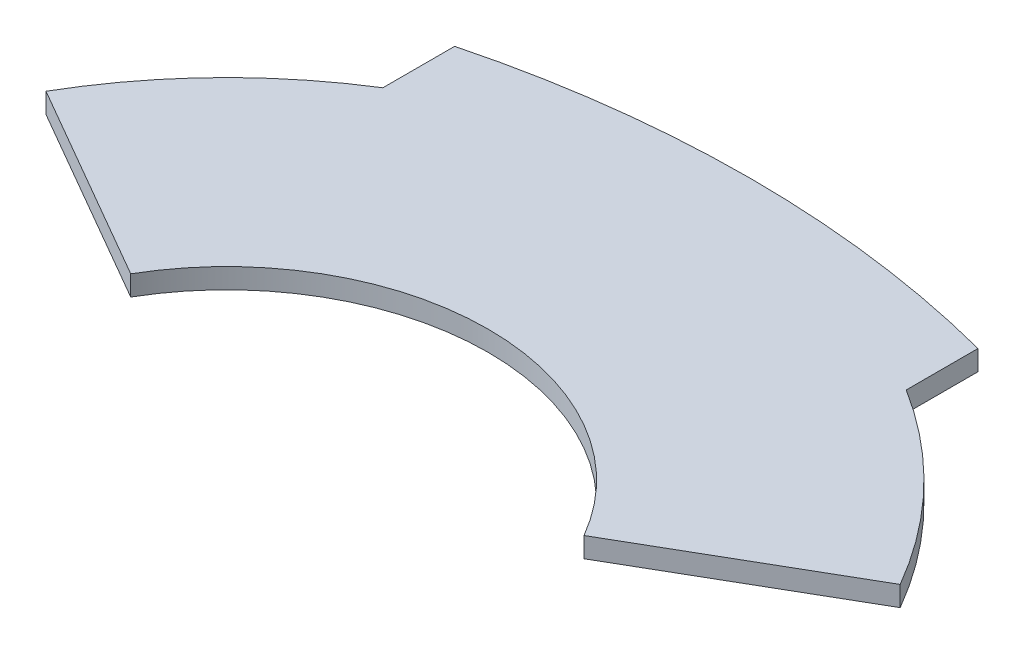
ISO-10303-21;
HEADER;
FILE_DESCRIPTION(('STEP AP214'),'2;1');
FILE_NAME('part.step','',(''),(''),'','','');
FILE_SCHEMA(('AUTOMOTIVE_DESIGN { 1 0 10303 214 1 1 1 1 }'));
ENDSEC;
DATA;
#1=APPLICATION_CONTEXT('core data for automotive mechanical design processes');
#2=APPLICATION_PROTOCOL_DEFINITION('international standard','automotive_design',2000,#1);
#3=PRODUCT_CONTEXT('',#1,'mechanical');
#4=PRODUCT('Part','Part','',(#3));
#5=PRODUCT_RELATED_PRODUCT_CATEGORY('part','',(#4));
#6=PRODUCT_DEFINITION_FORMATION('','',#4);
#7=PRODUCT_DEFINITION_CONTEXT('part definition',#1,'design');
#8=PRODUCT_DEFINITION('design','',#6,#7);
#9=PRODUCT_DEFINITION_SHAPE('','',#8);
#10=(LENGTH_UNIT() NAMED_UNIT(*) SI_UNIT(.MILLI.,.METRE.));
#11=(NAMED_UNIT(*) PLANE_ANGLE_UNIT() SI_UNIT($,.RADIAN.));
#12=(NAMED_UNIT(*) SI_UNIT($,.STERADIAN.) SOLID_ANGLE_UNIT());
#13=UNCERTAINTY_MEASURE_WITH_UNIT(LENGTH_MEASURE(1.E-05),#10,'distance_accuracy_value','');
#14=(GEOMETRIC_REPRESENTATION_CONTEXT(3) GLOBAL_UNCERTAINTY_ASSIGNED_CONTEXT((#13)) GLOBAL_UNIT_ASSIGNED_CONTEXT((#10,
#11,#12)) REPRESENTATION_CONTEXT('',''));
#15=CARTESIAN_POINT('',(0.,0.,0.));
#16=DIRECTION('',(0.,0.,1.));
#17=DIRECTION('',(1.,0.,0.));
#18=AXIS2_PLACEMENT_3D('',#15,#16,#17);
#19=CARTESIAN_POINT('',(0.,2.,-51.));
#20=DIRECTION('',(0.,-1.,0.));
#21=DIRECTION('',(0.,0.,-1.));
#22=AXIS2_PLACEMENT_3D('',#19,#20,#21);
#23=CYLINDRICAL_SURFACE('',#22,49.);
#24=CARTESIAN_POINT('',(0.,0.,-51.));
#25=DIRECTION('',(0.,1.,0.));
#26=DIRECTION('',(0.,0.,-1.));
#27=AXIS2_PLACEMENT_3D('',#24,#25,#26);
#28=CIRCLE('',#27,49.);
#29=CARTESIAN_POINT('',(-26.,0.,-92.5331193145904));
#30=VERTEX_POINT('',#29);
#31=CARTESIAN_POINT('',(-42.4352447854376,0.,-75.4999999999999));
#32=VERTEX_POINT('',#31);
#33=EDGE_CURVE('E150',#30,#32,#28,.T.);
#34=ORIENTED_EDGE('',*,*,#33,.T.);
#35=DIRECTION('',(0.,-1.,0.));
#36=VECTOR('',#35,1.);
#37=CARTESIAN_POINT('',(-42.4352447854376,2.,-75.4999999999999));
#38=LINE('',#37,#36);
#39=CARTESIAN_POINT('',(-42.4352447854376,2.,-75.4999999999999));
#40=VERTEX_POINT('',#39);
#41=EDGE_CURVE('E54',#40,#32,#38,.T.);
#42=ORIENTED_EDGE('',*,*,#41,.F.);
#43=CARTESIAN_POINT('',(0.,2.,-51.));
#44=DIRECTION('',(0.,1.,0.));
#45=DIRECTION('',(0.,0.,-1.));
#46=AXIS2_PLACEMENT_3D('',#43,#44,#45);
#47=CIRCLE('',#46,49.);
#48=CARTESIAN_POINT('',(-26.,2.,-92.5331193145904));
#49=VERTEX_POINT('',#48);
#50=EDGE_CURVE('E105',#49,#40,#47,.T.);
#51=ORIENTED_EDGE('',*,*,#50,.F.);
#52=DIRECTION('',(0.,-1.,0.));
#53=VECTOR('',#52,1.);
#54=CARTESIAN_POINT('',(-26.,2.,-92.5331193145904));
#55=LINE('',#54,#53);
#56=EDGE_CURVE('E11',#49,#30,#55,.T.);
#57=ORIENTED_EDGE('',*,*,#56,.T.);
#58=EDGE_LOOP('',(#34,#42,#51,#57));
#59=FACE_BOUND('',#58,.T.);
#60=ADVANCED_FACE('F45',(#59),#23,.T.);
#61=CARTESIAN_POINT('',(-22.5166604983954,2.,-63.9999999999999));
#62=DIRECTION('',(0.499999999999998,0.,-0.86602540378444));
#63=DIRECTION('',(-0.86602540378444,0.,-0.499999999999998));
#64=AXIS2_PLACEMENT_3D('',#61,#62,#63);
#65=PLANE('',#64);
#66=DIRECTION('',(0.86602540378444,0.,0.499999999999998));
#67=VECTOR('',#66,1.);
#68=CARTESIAN_POINT('',(-22.5166604983954,0.,-63.9999999999999));
#69=LINE('',#68,#67);
#70=CARTESIAN_POINT('',(-22.5166604983954,0.,-63.9999999999999));
#71=VERTEX_POINT('',#70);
#72=EDGE_CURVE('E153',#32,#71,#69,.T.);
#73=ORIENTED_EDGE('',*,*,#72,.T.);
#74=DIRECTION('',(0.,-1.,0.));
#75=VECTOR('',#74,1.);
#76=CARTESIAN_POINT('',(-22.5166604983954,2.,-63.9999999999999));
#77=LINE('',#76,#75);
#78=CARTESIAN_POINT('',(-22.5166604983954,2.,-63.9999999999999));
#79=VERTEX_POINT('',#78);
#80=EDGE_CURVE('E181',#79,#71,#77,.T.);
#81=ORIENTED_EDGE('',*,*,#80,.F.);
#82=DIRECTION('',(0.86602540378444,0.,0.499999999999998));
#83=VECTOR('',#82,1.);
#84=CARTESIAN_POINT('',(-22.5166604983954,2.,-63.9999999999999));
#85=LINE('',#84,#83);
#86=EDGE_CURVE('E191',#40,#79,#85,.T.);
#87=ORIENTED_EDGE('',*,*,#86,.F.);
#88=ORIENTED_EDGE('',*,*,#41,.T.);
#89=EDGE_LOOP('',(#73,#81,#87,#88));
#90=FACE_BOUND('',#89,.T.);
#91=ADVANCED_FACE('F189',(#90),#65,.F.);
#92=CARTESIAN_POINT('',(0.,2.,-51.));
#93=DIRECTION('',(0.,-1.,0.));
#94=DIRECTION('',(0.,0.,-1.));
#95=AXIS2_PLACEMENT_3D('',#92,#93,#94);
#96=CYLINDRICAL_SURFACE('',#95,26.);
#97=CARTESIAN_POINT('',(0.,0.,-51.));
#98=DIRECTION('',(0.,-1.,0.));
#99=DIRECTION('',(0.,0.,-1.));
#100=AXIS2_PLACEMENT_3D('',#97,#98,#99);
#101=CIRCLE('',#100,26.);
#102=CARTESIAN_POINT('',(22.5166604983954,0.,-63.9999999999999));
#103=VERTEX_POINT('',#102);
#104=EDGE_CURVE('E156',#71,#103,#101,.T.);
#105=ORIENTED_EDGE('',*,*,#104,.T.);
#106=DIRECTION('',(0.,-1.,0.));
#107=VECTOR('',#106,1.);
#108=CARTESIAN_POINT('',(22.5166604983954,2.,-63.9999999999999));
#109=LINE('',#108,#107);
#110=CARTESIAN_POINT('',(22.5166604983954,2.,-63.9999999999999));
#111=VERTEX_POINT('',#110);
#112=EDGE_CURVE('E177',#111,#103,#109,.T.);
#113=ORIENTED_EDGE('',*,*,#112,.F.);
#114=CARTESIAN_POINT('',(0.,2.,-51.));
#115=DIRECTION('',(0.,-1.,0.));
#116=DIRECTION('',(0.,0.,-1.));
#117=AXIS2_PLACEMENT_3D('',#114,#115,#116);
#118=CIRCLE('',#117,26.);
#119=EDGE_CURVE('E205',#79,#111,#118,.T.);
#120=ORIENTED_EDGE('',*,*,#119,.F.);
#121=ORIENTED_EDGE('',*,*,#80,.T.);
#122=EDGE_LOOP('',(#105,#113,#120,#121));
#123=FACE_BOUND('',#122,.T.);
#124=ADVANCED_FACE('F200',(#123),#96,.F.);
#125=CARTESIAN_POINT('',(22.5166604983954,2.,-63.9999999999999));
#126=DIRECTION('',(-0.499999999999997,0.,-0.86602540378444));
#127=DIRECTION('',(-0.86602540378444,0.,0.499999999999997));
#128=AXIS2_PLACEMENT_3D('',#125,#126,#127);
#129=PLANE('',#128);
#130=DIRECTION('',(0.86602540378444,0.,-0.499999999999997));
#131=VECTOR('',#130,1.);
#132=CARTESIAN_POINT('',(22.5166604983954,0.,-63.9999999999999));
#133=LINE('',#132,#131);
#134=CARTESIAN_POINT('',(42.4352447854376,0.,-75.4999999999999));
#135=VERTEX_POINT('',#134);
#136=EDGE_CURVE('E159',#103,#135,#133,.T.);
#137=ORIENTED_EDGE('',*,*,#136,.T.);
#138=DIRECTION('',(0.,-1.,0.));
#139=VECTOR('',#138,1.);
#140=CARTESIAN_POINT('',(42.4352447854376,2.,-75.4999999999999));
#141=LINE('',#140,#139);
#142=CARTESIAN_POINT('',(42.4352447854376,2.,-75.4999999999999));
#143=VERTEX_POINT('',#142);
#144=EDGE_CURVE('E137',#143,#135,#141,.T.);
#145=ORIENTED_EDGE('',*,*,#144,.F.);
#146=DIRECTION('',(0.86602540378444,0.,-0.499999999999997));
#147=VECTOR('',#146,1.);
#148=CARTESIAN_POINT('',(22.5166604983954,2.,-63.9999999999999));
#149=LINE('',#148,#147);
#150=EDGE_CURVE('E125',#111,#143,#149,.T.);
#151=ORIENTED_EDGE('',*,*,#150,.F.);
#152=ORIENTED_EDGE('',*,*,#112,.T.);
#153=EDGE_LOOP('',(#137,#145,#151,#152));
#154=FACE_BOUND('',#153,.T.);
#155=ADVANCED_FACE('F203',(#154),#129,.F.);
#156=CARTESIAN_POINT('',(0.,2.,-51.));
#157=DIRECTION('',(0.,-1.,0.));
#158=DIRECTION('',(0.,0.,-1.));
#159=AXIS2_PLACEMENT_3D('',#156,#157,#158);
#160=CYLINDRICAL_SURFACE('',#159,49.);
#161=CARTESIAN_POINT('',(0.,0.,-51.));
#162=DIRECTION('',(0.,1.,0.));
#163=DIRECTION('',(0.,0.,1.));
#164=AXIS2_PLACEMENT_3D('',#161,#162,#163);
#165=CIRCLE('',#164,49.);
#166=CARTESIAN_POINT('',(26.,0.,-92.5331193145904));
#167=VERTEX_POINT('',#166);
#168=EDGE_CURVE('E135',#135,#167,#165,.T.);
#169=ORIENTED_EDGE('',*,*,#168,.T.);
#170=DIRECTION('',(0.,-1.,0.));
#171=VECTOR('',#170,1.);
#172=CARTESIAN_POINT('',(26.,2.,-92.5331193145904));
#173=LINE('',#172,#171);
#174=CARTESIAN_POINT('',(26.,2.,-92.5331193145904));
#175=VERTEX_POINT('',#174);
#176=EDGE_CURVE('E132',#175,#167,#173,.T.);
#177=ORIENTED_EDGE('',*,*,#176,.F.);
#178=CARTESIAN_POINT('',(0.,2.,-51.));
#179=DIRECTION('',(0.,1.,0.));
#180=DIRECTION('',(0.,0.,1.));
#181=AXIS2_PLACEMENT_3D('',#178,#179,#180);
#182=CIRCLE('',#181,49.);
#183=EDGE_CURVE('E119',#143,#175,#182,.T.);
#184=ORIENTED_EDGE('',*,*,#183,.F.);
#185=ORIENTED_EDGE('',*,*,#144,.T.);
#186=EDGE_LOOP('',(#169,#177,#184,#185));
#187=FACE_BOUND('',#186,.T.);
#188=ADVANCED_FACE('F133',(#187),#160,.T.);
#189=CARTESIAN_POINT('',(26.,2.,-99.6644369873226));
#190=DIRECTION('',(-1.,0.,0.));
#191=DIRECTION('',(0.,0.,1.));
#192=AXIS2_PLACEMENT_3D('',#189,#190,#191);
#193=PLANE('',#192);
#194=DIRECTION('',(0.,0.,-1.));
#195=VECTOR('',#194,1.);
#196=CARTESIAN_POINT('',(26.,0.,-99.6644369873226));
#197=LINE('',#196,#195);
#198=CARTESIAN_POINT('',(26.,0.,-99.6644369873226));
#199=VERTEX_POINT('',#198);
#200=EDGE_CURVE('E91',#167,#199,#197,.T.);
#201=ORIENTED_EDGE('',*,*,#200,.T.);
#202=DIRECTION('',(0.,-1.,0.));
#203=VECTOR('',#202,1.);
#204=CARTESIAN_POINT('',(26.,2.,-99.6644369873226));
#205=LINE('',#204,#203);
#206=CARTESIAN_POINT('',(26.,2.,-99.6644369873226));
#207=VERTEX_POINT('',#206);
#208=EDGE_CURVE('E138',#207,#199,#205,.T.);
#209=ORIENTED_EDGE('',*,*,#208,.F.);
#210=DIRECTION('',(0.,0.,-1.));
#211=VECTOR('',#210,1.);
#212=CARTESIAN_POINT('',(26.0000000000001,2.,-96.5608616365865));
#213=LINE('',#212,#211);
#214=EDGE_CURVE('E123',#175,#207,#213,.T.);
#215=ORIENTED_EDGE('',*,*,#214,.F.);
#216=ORIENTED_EDGE('',*,*,#176,.T.);
#217=EDGE_LOOP('',(#201,#209,#215,#216));
#218=FACE_BOUND('',#217,.T.);
#219=ADVANCED_FACE('F140',(#218),#193,.F.);
#220=CARTESIAN_POINT('',(0.,2.,0.));
#221=DIRECTION('',(0.,-1.,0.));
#222=DIRECTION('',(0.,0.,-1.));
#223=AXIS2_PLACEMENT_3D('',#220,#221,#222);
#224=CYLINDRICAL_SURFACE('',#223,103.);
#225=CARTESIAN_POINT('',(0.,0.,0.));
#226=DIRECTION('',(0.,1.,0.));
#227=DIRECTION('',(0.,0.,-1.));
#228=AXIS2_PLACEMENT_3D('',#225,#226,#227);
#229=CIRCLE('',#228,103.);
#230=CARTESIAN_POINT('',(-26.,0.,-99.6644369873226));
#231=VERTEX_POINT('',#230);
#232=EDGE_CURVE('E98',#199,#231,#229,.T.);
#233=ORIENTED_EDGE('',*,*,#232,.T.);
#234=DIRECTION('',(0.,-1.,0.));
#235=VECTOR('',#234,1.);
#236=CARTESIAN_POINT('',(-26.,2.,-99.6644369873226));
#237=LINE('',#236,#235);
#238=CARTESIAN_POINT('',(-26.,2.,-99.6644369873226));
#239=VERTEX_POINT('',#238);
#240=EDGE_CURVE('E146',#239,#231,#237,.T.);
#241=ORIENTED_EDGE('',*,*,#240,.F.);
#242=CARTESIAN_POINT('',(0.,2.,0.));
#243=DIRECTION('',(0.,1.,0.));
#244=DIRECTION('',(0.,0.,-1.));
#245=AXIS2_PLACEMENT_3D('',#242,#243,#244);
#246=CIRCLE('',#245,103.);
#247=EDGE_CURVE('E143',#207,#239,#246,.T.);
#248=ORIENTED_EDGE('',*,*,#247,.F.);
#249=ORIENTED_EDGE('',*,*,#208,.T.);
#250=EDGE_LOOP('',(#233,#241,#248,#249));
#251=FACE_BOUND('',#250,.T.);
#252=ADVANCED_FACE('F230',(#251),#224,.T.);
#253=CARTESIAN_POINT('',(-26.,2.,-99.6644369873226));
#254=DIRECTION('',(1.,0.,0.));
#255=DIRECTION('',(0.,0.,-1.));
#256=AXIS2_PLACEMENT_3D('',#253,#254,#255);
#257=PLANE('',#256);
#258=DIRECTION('',(0.,0.,1.));
#259=VECTOR('',#258,1.);
#260=CARTESIAN_POINT('',(-26.,0.,-99.6644369873226));
#261=LINE('',#260,#259);
#262=EDGE_CURVE('E168',#231,#30,#261,.T.);
#263=ORIENTED_EDGE('',*,*,#262,.T.);
#264=ORIENTED_EDGE('',*,*,#56,.F.);
#265=DIRECTION('',(0.,0.,1.));
#266=VECTOR('',#265,1.);
#267=CARTESIAN_POINT('',(-26.,2.,-96.5608616365865));
#268=LINE('',#267,#266);
#269=EDGE_CURVE('E62',#239,#49,#268,.T.);
#270=ORIENTED_EDGE('',*,*,#269,.F.);
#271=ORIENTED_EDGE('',*,*,#240,.T.);
#272=EDGE_LOOP('',(#263,#264,#270,#271));
#273=FACE_BOUND('',#272,.T.);
#274=ADVANCED_FACE('F214',(#273),#257,.F.);
#275=CARTESIAN_POINT('',(0.,2.,-51.));
#276=DIRECTION('',(0.,-1.,0.));
#277=DIRECTION('',(0.,0.,-1.));
#278=AXIS2_PLACEMENT_3D('',#275,#276,#277);
#279=PLANE('',#278);
#280=ORIENTED_EDGE('',*,*,#269,.T.);
#281=ORIENTED_EDGE('',*,*,#50,.T.);
#282=ORIENTED_EDGE('',*,*,#86,.T.);
#283=ORIENTED_EDGE('',*,*,#119,.T.);
#284=ORIENTED_EDGE('',*,*,#150,.T.);
#285=ORIENTED_EDGE('',*,*,#183,.T.);
#286=ORIENTED_EDGE('',*,*,#214,.T.);
#287=ORIENTED_EDGE('',*,*,#247,.T.);
#288=EDGE_LOOP('',(#280,#281,#282,#283,#284,#285,#286,#287));
#289=FACE_BOUND('',#288,.T.);
#290=ADVANCED_FACE('F121',(#289),#279,.F.);
#291=CARTESIAN_POINT('',(0.,0.,-51.));
#292=DIRECTION('',(0.,-1.,0.));
#293=DIRECTION('',(0.,0.,-1.));
#294=AXIS2_PLACEMENT_3D('',#291,#292,#293);
#295=PLANE('',#294);
#296=ORIENTED_EDGE('',*,*,#33,.F.);
#297=ORIENTED_EDGE('',*,*,#262,.F.);
#298=ORIENTED_EDGE('',*,*,#232,.F.);
#299=ORIENTED_EDGE('',*,*,#200,.F.);
#300=ORIENTED_EDGE('',*,*,#168,.F.);
#301=ORIENTED_EDGE('',*,*,#136,.F.);
#302=ORIENTED_EDGE('',*,*,#104,.F.);
#303=ORIENTED_EDGE('',*,*,#72,.F.);
#304=EDGE_LOOP('',(#296,#297,#298,#299,#300,#301,#302,#303));
#305=FACE_BOUND('',#304,.T.);
#306=ADVANCED_FACE('F195',(#305),#295,.T.);
#307=CLOSED_SHELL('',(#60,#91,#124,#155,#188,#219,#252,#274,#290,#306));
#308=MANIFOLD_SOLID_BREP('B2',#307);
#309=ADVANCED_BREP_SHAPE_REPRESENTATION('',(#18,#308),#14);
#310=SHAPE_DEFINITION_REPRESENTATION(#9,#309);
ENDSEC;
END-ISO-10303-21;
